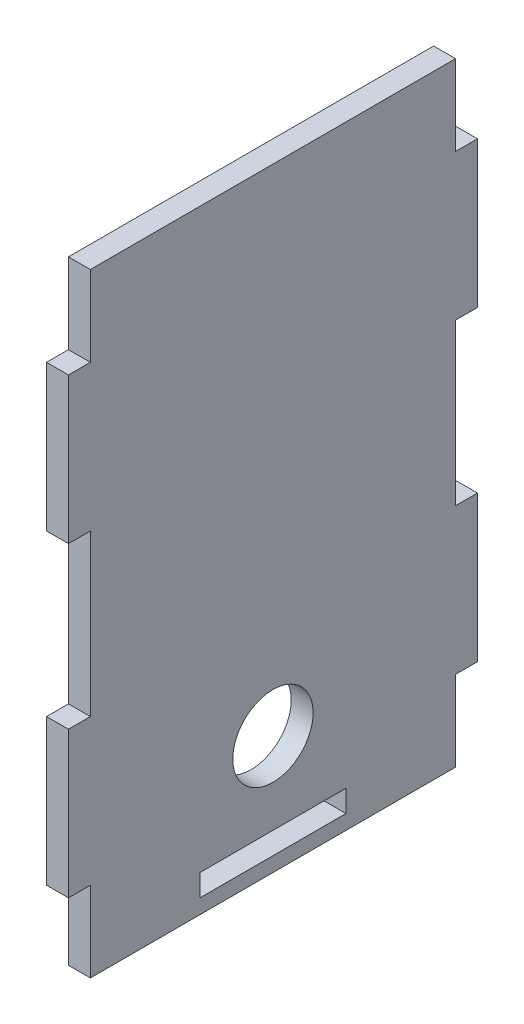
ISO-10303-21;
HEADER;
FILE_DESCRIPTION(('STEP AP214'),'2;1');
FILE_NAME('part.step','',(''),(''),'','','');
FILE_SCHEMA(('AUTOMOTIVE_DESIGN { 1 0 10303 214 1 1 1 1 }'));
ENDSEC;
DATA;
#1=APPLICATION_CONTEXT('core data for automotive mechanical design processes');
#2=APPLICATION_PROTOCOL_DEFINITION('international standard','automotive_design',2000,#1);
#3=PRODUCT_CONTEXT('',#1,'mechanical');
#4=PRODUCT('Part','Part','',(#3));
#5=PRODUCT_RELATED_PRODUCT_CATEGORY('part','',(#4));
#6=PRODUCT_DEFINITION_FORMATION('','',#4);
#7=PRODUCT_DEFINITION_CONTEXT('part definition',#1,'design');
#8=PRODUCT_DEFINITION('design','',#6,#7);
#9=PRODUCT_DEFINITION_SHAPE('','',#8);
#10=(LENGTH_UNIT() NAMED_UNIT(*) SI_UNIT(.MILLI.,.METRE.));
#11=(NAMED_UNIT(*) PLANE_ANGLE_UNIT() SI_UNIT($,.RADIAN.));
#12=(NAMED_UNIT(*) SI_UNIT($,.STERADIAN.) SOLID_ANGLE_UNIT());
#13=UNCERTAINTY_MEASURE_WITH_UNIT(LENGTH_MEASURE(1.E-05),#10,'distance_accuracy_value','');
#14=(GEOMETRIC_REPRESENTATION_CONTEXT(3) GLOBAL_UNCERTAINTY_ASSIGNED_CONTEXT((#13)) GLOBAL_UNIT_ASSIGNED_CONTEXT((#10,
#11,#12)) REPRESENTATION_CONTEXT('',''));
#15=CARTESIAN_POINT('',(0.,0.,0.));
#16=DIRECTION('',(0.,0.,1.));
#17=DIRECTION('',(1.,0.,0.));
#18=AXIS2_PLACEMENT_3D('',#15,#16,#17);
#19=CARTESIAN_POINT('',(3.,0.,0.));
#20=DIRECTION('',(1.,0.,0.));
#21=DIRECTION('',(0.,0.,-1.));
#22=AXIS2_PLACEMENT_3D('',#19,#20,#21);
#23=PLANE('',#22);
#24=DIRECTION('',(0.,0.,1.));
#25=VECTOR('',#24,1.);
#26=CARTESIAN_POINT('',(3.,5.,-15.));
#27=LINE('',#26,#25);
#28=CARTESIAN_POINT('',(3.,5.,-35.));
#29=VERTEX_POINT('',#28);
#30=CARTESIAN_POINT('',(3.,5.,-15.));
#31=VERTEX_POINT('',#30);
#32=EDGE_CURVE('E208',#29,#31,#27,.T.);
#33=ORIENTED_EDGE('',*,*,#32,.F.);
#34=DIRECTION('',(0.,1.,0.));
#35=VECTOR('',#34,1.);
#36=CARTESIAN_POINT('',(3.,2.,-35.));
#37=LINE('',#36,#35);
#38=CARTESIAN_POINT('',(3.,2.,-35.));
#39=VERTEX_POINT('',#38);
#40=EDGE_CURVE('E200',#39,#29,#37,.T.);
#41=ORIENTED_EDGE('',*,*,#40,.F.);
#42=DIRECTION('',(0.,0.,-1.));
#43=VECTOR('',#42,1.);
#44=CARTESIAN_POINT('',(3.,2.,-15.));
#45=LINE('',#44,#43);
#46=CARTESIAN_POINT('',(3.,2.,-15.));
#47=VERTEX_POINT('',#46);
#48=EDGE_CURVE('E223',#47,#39,#45,.T.);
#49=ORIENTED_EDGE('',*,*,#48,.F.);
#50=DIRECTION('',(0.,-1.,0.));
#51=VECTOR('',#50,1.);
#52=CARTESIAN_POINT('',(3.,2.,-15.));
#53=LINE('',#52,#51);
#54=EDGE_CURVE('E221',#31,#47,#53,.T.);
#55=ORIENTED_EDGE('',*,*,#54,.F.);
#56=EDGE_LOOP('',(#33,#41,#49,#55));
#57=FACE_BOUND('',#56,.T.);
#58=DIRECTION('',(0.,-1.,0.));
#59=VECTOR('',#58,1.);
#60=CARTESIAN_POINT('',(3.,0.,0.));
#61=LINE('',#60,#59);
#62=CARTESIAN_POINT('',(3.,11.,0.));
#63=VERTEX_POINT('',#62);
#64=CARTESIAN_POINT('',(3.,0.,0.));
#65=VERTEX_POINT('',#64);
#66=EDGE_CURVE('E239',#63,#65,#61,.T.);
#67=ORIENTED_EDGE('',*,*,#66,.T.);
#68=DIRECTION('',(0.,0.,-1.));
#69=VECTOR('',#68,1.);
#70=CARTESIAN_POINT('',(3.,0.,0.));
#71=LINE('',#70,#69);
#72=CARTESIAN_POINT('',(3.,0.,-50.));
#73=VERTEX_POINT('',#72);
#74=EDGE_CURVE('E242',#65,#73,#71,.T.);
#75=ORIENTED_EDGE('',*,*,#74,.T.);
#76=DIRECTION('',(0.,1.,0.));
#77=VECTOR('',#76,1.);
#78=CARTESIAN_POINT('',(3.,0.,-50.));
#79=LINE('',#78,#77);
#80=CARTESIAN_POINT('',(3.,11.,-50.));
#81=VERTEX_POINT('',#80);
#82=EDGE_CURVE('E245',#73,#81,#79,.T.);
#83=ORIENTED_EDGE('',*,*,#82,.T.);
#84=DIRECTION('',(0.,0.,-1.));
#85=VECTOR('',#84,1.);
#86=CARTESIAN_POINT('',(3.,11.,-50.));
#87=LINE('',#86,#85);
#88=CARTESIAN_POINT('',(3.,11.,-53.));
#89=VERTEX_POINT('',#88);
#90=EDGE_CURVE('E247',#81,#89,#87,.T.);
#91=ORIENTED_EDGE('',*,*,#90,.T.);
#92=DIRECTION('',(0.,1.,0.));
#93=VECTOR('',#92,1.);
#94=CARTESIAN_POINT('',(3.,31.,-53.));
#95=LINE('',#94,#93);
#96=CARTESIAN_POINT('',(3.,31.,-53.));
#97=VERTEX_POINT('',#96);
#98=EDGE_CURVE('E249',#89,#97,#95,.T.);
#99=ORIENTED_EDGE('',*,*,#98,.T.);
#100=DIRECTION('',(0.,0.,1.));
#101=VECTOR('',#100,1.);
#102=CARTESIAN_POINT('',(3.,31.,-50.));
#103=LINE('',#102,#101);
#104=CARTESIAN_POINT('',(3.,31.,-50.));
#105=VERTEX_POINT('',#104);
#106=EDGE_CURVE('E251',#97,#105,#103,.T.);
#107=ORIENTED_EDGE('',*,*,#106,.T.);
#108=DIRECTION('',(0.,1.,0.));
#109=VECTOR('',#108,1.);
#110=CARTESIAN_POINT('',(3.,31.,-50.));
#111=LINE('',#110,#109);
#112=CARTESIAN_POINT('',(3.,53.,-50.));
#113=VERTEX_POINT('',#112);
#114=EDGE_CURVE('E253',#105,#113,#111,.T.);
#115=ORIENTED_EDGE('',*,*,#114,.T.);
#116=DIRECTION('',(0.,0.,-1.));
#117=VECTOR('',#116,1.);
#118=CARTESIAN_POINT('',(3.,53.,-50.));
#119=LINE('',#118,#117);
#120=CARTESIAN_POINT('',(3.,53.,-53.));
#121=VERTEX_POINT('',#120);
#122=EDGE_CURVE('E255',#113,#121,#119,.T.);
#123=ORIENTED_EDGE('',*,*,#122,.T.);
#124=DIRECTION('',(0.,1.,0.));
#125=VECTOR('',#124,1.);
#126=CARTESIAN_POINT('',(3.,53.,-53.));
#127=LINE('',#126,#125);
#128=CARTESIAN_POINT('',(3.,73.,-53.));
#129=VERTEX_POINT('',#128);
#130=EDGE_CURVE('E257',#121,#129,#127,.T.);
#131=ORIENTED_EDGE('',*,*,#130,.T.);
#132=DIRECTION('',(0.,0.,1.));
#133=VECTOR('',#132,1.);
#134=CARTESIAN_POINT('',(3.,73.,-50.));
#135=LINE('',#134,#133);
#136=CARTESIAN_POINT('',(3.,73.,-50.));
#137=VERTEX_POINT('',#136);
#138=EDGE_CURVE('E259',#129,#137,#135,.T.);
#139=ORIENTED_EDGE('',*,*,#138,.T.);
#140=DIRECTION('',(0.,1.,0.));
#141=VECTOR('',#140,1.);
#142=CARTESIAN_POINT('',(3.,73.,-50.));
#143=LINE('',#142,#141);
#144=CARTESIAN_POINT('',(3.,84.,-50.));
#145=VERTEX_POINT('',#144);
#146=EDGE_CURVE('E261',#137,#145,#143,.T.);
#147=ORIENTED_EDGE('',*,*,#146,.T.);
#148=DIRECTION('',(0.,0.,1.));
#149=VECTOR('',#148,1.);
#150=CARTESIAN_POINT('',(3.,84.,0.));
#151=LINE('',#150,#149);
#152=CARTESIAN_POINT('',(3.,84.,0.));
#153=VERTEX_POINT('',#152);
#154=EDGE_CURVE('E263',#145,#153,#151,.T.);
#155=ORIENTED_EDGE('',*,*,#154,.T.);
#156=DIRECTION('',(0.,-1.,0.));
#157=VECTOR('',#156,1.);
#158=CARTESIAN_POINT('',(3.,73.,0.));
#159=LINE('',#158,#157);
#160=CARTESIAN_POINT('',(3.,73.,0.));
#161=VERTEX_POINT('',#160);
#162=EDGE_CURVE('E265',#153,#161,#159,.T.);
#163=ORIENTED_EDGE('',*,*,#162,.T.);
#164=DIRECTION('',(0.,0.,1.));
#165=VECTOR('',#164,1.);
#166=CARTESIAN_POINT('',(3.,73.,0.));
#167=LINE('',#166,#165);
#168=CARTESIAN_POINT('',(3.,73.,3.));
#169=VERTEX_POINT('',#168);
#170=EDGE_CURVE('E267',#161,#169,#167,.T.);
#171=ORIENTED_EDGE('',*,*,#170,.T.);
#172=DIRECTION('',(0.,-1.,0.));
#173=VECTOR('',#172,1.);
#174=CARTESIAN_POINT('',(3.,53.,3.));
#175=LINE('',#174,#173);
#176=CARTESIAN_POINT('',(3.,53.,3.));
#177=VERTEX_POINT('',#176);
#178=EDGE_CURVE('E269',#169,#177,#175,.T.);
#179=ORIENTED_EDGE('',*,*,#178,.T.);
#180=DIRECTION('',(0.,0.,-1.));
#181=VECTOR('',#180,1.);
#182=CARTESIAN_POINT('',(3.,53.,0.));
#183=LINE('',#182,#181);
#184=CARTESIAN_POINT('',(3.,53.,0.));
#185=VERTEX_POINT('',#184);
#186=EDGE_CURVE('E271',#177,#185,#183,.T.);
#187=ORIENTED_EDGE('',*,*,#186,.T.);
#188=DIRECTION('',(0.,-1.,0.));
#189=VECTOR('',#188,1.);
#190=CARTESIAN_POINT('',(3.,31.,0.));
#191=LINE('',#190,#189);
#192=CARTESIAN_POINT('',(3.,31.,0.));
#193=VERTEX_POINT('',#192);
#194=EDGE_CURVE('E273',#185,#193,#191,.T.);
#195=ORIENTED_EDGE('',*,*,#194,.T.);
#196=DIRECTION('',(0.,0.,1.));
#197=VECTOR('',#196,1.);
#198=CARTESIAN_POINT('',(3.,31.,0.));
#199=LINE('',#198,#197);
#200=CARTESIAN_POINT('',(3.,31.,3.));
#201=VERTEX_POINT('',#200);
#202=EDGE_CURVE('E275',#193,#201,#199,.T.);
#203=ORIENTED_EDGE('',*,*,#202,.T.);
#204=DIRECTION('',(0.,-1.,0.));
#205=VECTOR('',#204,1.);
#206=CARTESIAN_POINT('',(3.,31.,3.));
#207=LINE('',#206,#205);
#208=CARTESIAN_POINT('',(3.,11.,3.));
#209=VERTEX_POINT('',#208);
#210=EDGE_CURVE('E277',#201,#209,#207,.T.);
#211=ORIENTED_EDGE('',*,*,#210,.T.);
#212=DIRECTION('',(0.,0.,-1.));
#213=VECTOR('',#212,1.);
#214=CARTESIAN_POINT('',(3.,11.,0.));
#215=LINE('',#214,#213);
#216=EDGE_CURVE('E279',#209,#63,#215,.T.);
#217=ORIENTED_EDGE('',*,*,#216,.T.);
#218=EDGE_LOOP('',(#67,#75,#83,#91,#99,#107,#115,#123,#131,#139,#147,#155,#163,#171,#179,#187,
#195,#203,#211,#217));
#219=FACE_BOUND('',#218,.T.);
#220=CARTESIAN_POINT('',(3.,16.2,-25.));
#221=DIRECTION('',(1.,0.,0.));
#222=DIRECTION('',(0.,0.,-1.));
#223=AXIS2_PLACEMENT_3D('',#220,#221,#222);
#224=CIRCLE('',#223,5.5);
#225=CARTESIAN_POINT('',(3.,16.2,-30.5));
#226=VERTEX_POINT('',#225);
#227=EDGE_CURVE('E229',#226,#226,#224,.T.);
#228=ORIENTED_EDGE('',*,*,#227,.F.);
#229=EDGE_LOOP('',(#228));
#230=FACE_BOUND('',#229,.T.);
#231=ADVANCED_FACE('F39',(#57,#219,#230),#23,.T.);
#232=CARTESIAN_POINT('',(0.,0.,0.));
#233=DIRECTION('',(1.,0.,0.));
#234=DIRECTION('',(0.,0.,-1.));
#235=AXIS2_PLACEMENT_3D('',#232,#233,#234);
#236=PLANE('',#235);
#237=DIRECTION('',(0.,-1.,0.));
#238=VECTOR('',#237,1.);
#239=CARTESIAN_POINT('',(0.,0.,0.));
#240=LINE('',#239,#238);
#241=CARTESIAN_POINT('',(0.,11.,0.));
#242=VERTEX_POINT('',#241);
#243=CARTESIAN_POINT('',(0.,0.,0.));
#244=VERTEX_POINT('',#243);
#245=EDGE_CURVE('E216',#242,#244,#240,.T.);
#246=ORIENTED_EDGE('',*,*,#245,.F.);
#247=DIRECTION('',(0.,0.,-1.));
#248=VECTOR('',#247,1.);
#249=CARTESIAN_POINT('',(0.,11.,0.));
#250=LINE('',#249,#248);
#251=CARTESIAN_POINT('',(0.,11.,3.));
#252=VERTEX_POINT('',#251);
#253=EDGE_CURVE('E243',#252,#242,#250,.T.);
#254=ORIENTED_EDGE('',*,*,#253,.F.);
#255=DIRECTION('',(0.,-1.,0.));
#256=VECTOR('',#255,1.);
#257=CARTESIAN_POINT('',(0.,31.,3.));
#258=LINE('',#257,#256);
#259=CARTESIAN_POINT('',(0.,31.,3.));
#260=VERTEX_POINT('',#259);
#261=EDGE_CURVE('E318',#260,#252,#258,.T.);
#262=ORIENTED_EDGE('',*,*,#261,.F.);
#263=DIRECTION('',(0.,0.,1.));
#264=VECTOR('',#263,1.);
#265=CARTESIAN_POINT('',(0.,31.,0.));
#266=LINE('',#265,#264);
#267=CARTESIAN_POINT('',(0.,31.,0.));
#268=VERTEX_POINT('',#267);
#269=EDGE_CURVE('E316',#268,#260,#266,.T.);
#270=ORIENTED_EDGE('',*,*,#269,.F.);
#271=DIRECTION('',(0.,-1.,0.));
#272=VECTOR('',#271,1.);
#273=CARTESIAN_POINT('',(0.,31.,0.));
#274=LINE('',#273,#272);
#275=CARTESIAN_POINT('',(0.,53.,0.));
#276=VERTEX_POINT('',#275);
#277=EDGE_CURVE('E314',#276,#268,#274,.T.);
#278=ORIENTED_EDGE('',*,*,#277,.F.);
#279=DIRECTION('',(0.,0.,-1.));
#280=VECTOR('',#279,1.);
#281=CARTESIAN_POINT('',(0.,53.,0.));
#282=LINE('',#281,#280);
#283=CARTESIAN_POINT('',(0.,53.,3.));
#284=VERTEX_POINT('',#283);
#285=EDGE_CURVE('E312',#284,#276,#282,.T.);
#286=ORIENTED_EDGE('',*,*,#285,.F.);
#287=DIRECTION('',(0.,-1.,0.));
#288=VECTOR('',#287,1.);
#289=CARTESIAN_POINT('',(0.,53.,3.));
#290=LINE('',#289,#288);
#291=CARTESIAN_POINT('',(0.,73.,3.));
#292=VERTEX_POINT('',#291);
#293=EDGE_CURVE('E310',#292,#284,#290,.T.);
#294=ORIENTED_EDGE('',*,*,#293,.F.);
#295=DIRECTION('',(0.,0.,1.));
#296=VECTOR('',#295,1.);
#297=CARTESIAN_POINT('',(0.,73.,0.));
#298=LINE('',#297,#296);
#299=CARTESIAN_POINT('',(0.,73.,0.));
#300=VERTEX_POINT('',#299);
#301=EDGE_CURVE('E308',#300,#292,#298,.T.);
#302=ORIENTED_EDGE('',*,*,#301,.F.);
#303=DIRECTION('',(0.,-1.,0.));
#304=VECTOR('',#303,1.);
#305=CARTESIAN_POINT('',(0.,73.,0.));
#306=LINE('',#305,#304);
#307=CARTESIAN_POINT('',(0.,84.,0.));
#308=VERTEX_POINT('',#307);
#309=EDGE_CURVE('E306',#308,#300,#306,.T.);
#310=ORIENTED_EDGE('',*,*,#309,.F.);
#311=DIRECTION('',(0.,0.,1.));
#312=VECTOR('',#311,1.);
#313=CARTESIAN_POINT('',(0.,84.,0.));
#314=LINE('',#313,#312);
#315=CARTESIAN_POINT('',(0.,84.,-50.));
#316=VERTEX_POINT('',#315);
#317=EDGE_CURVE('E304',#316,#308,#314,.T.);
#318=ORIENTED_EDGE('',*,*,#317,.F.);
#319=DIRECTION('',(0.,1.,0.));
#320=VECTOR('',#319,1.);
#321=CARTESIAN_POINT('',(0.,73.,-50.));
#322=LINE('',#321,#320);
#323=CARTESIAN_POINT('',(0.,73.,-50.));
#324=VERTEX_POINT('',#323);
#325=EDGE_CURVE('E302',#324,#316,#322,.T.);
#326=ORIENTED_EDGE('',*,*,#325,.F.);
#327=DIRECTION('',(0.,0.,1.));
#328=VECTOR('',#327,1.);
#329=CARTESIAN_POINT('',(0.,73.,-50.));
#330=LINE('',#329,#328);
#331=CARTESIAN_POINT('',(0.,73.,-53.));
#332=VERTEX_POINT('',#331);
#333=EDGE_CURVE('E300',#332,#324,#330,.T.);
#334=ORIENTED_EDGE('',*,*,#333,.F.);
#335=DIRECTION('',(0.,1.,0.));
#336=VECTOR('',#335,1.);
#337=CARTESIAN_POINT('',(0.,53.,-53.));
#338=LINE('',#337,#336);
#339=CARTESIAN_POINT('',(0.,53.,-53.));
#340=VERTEX_POINT('',#339);
#341=EDGE_CURVE('E298',#340,#332,#338,.T.);
#342=ORIENTED_EDGE('',*,*,#341,.F.);
#343=DIRECTION('',(0.,0.,-1.));
#344=VECTOR('',#343,1.);
#345=CARTESIAN_POINT('',(0.,53.,-50.));
#346=LINE('',#345,#344);
#347=CARTESIAN_POINT('',(0.,53.,-50.));
#348=VERTEX_POINT('',#347);
#349=EDGE_CURVE('E296',#348,#340,#346,.T.);
#350=ORIENTED_EDGE('',*,*,#349,.F.);
#351=DIRECTION('',(0.,1.,0.));
#352=VECTOR('',#351,1.);
#353=CARTESIAN_POINT('',(0.,31.,-50.));
#354=LINE('',#353,#352);
#355=CARTESIAN_POINT('',(0.,31.,-50.));
#356=VERTEX_POINT('',#355);
#357=EDGE_CURVE('E294',#356,#348,#354,.T.);
#358=ORIENTED_EDGE('',*,*,#357,.F.);
#359=DIRECTION('',(0.,0.,1.));
#360=VECTOR('',#359,1.);
#361=CARTESIAN_POINT('',(0.,31.,-50.));
#362=LINE('',#361,#360);
#363=CARTESIAN_POINT('',(0.,31.,-53.));
#364=VERTEX_POINT('',#363);
#365=EDGE_CURVE('E292',#364,#356,#362,.T.);
#366=ORIENTED_EDGE('',*,*,#365,.F.);
#367=DIRECTION('',(0.,1.,0.));
#368=VECTOR('',#367,1.);
#369=CARTESIAN_POINT('',(0.,31.,-53.));
#370=LINE('',#369,#368);
#371=CARTESIAN_POINT('',(0.,11.,-53.));
#372=VERTEX_POINT('',#371);
#373=EDGE_CURVE('E290',#372,#364,#370,.T.);
#374=ORIENTED_EDGE('',*,*,#373,.F.);
#375=DIRECTION('',(0.,0.,-1.));
#376=VECTOR('',#375,1.);
#377=CARTESIAN_POINT('',(0.,11.,-50.));
#378=LINE('',#377,#376);
#379=CARTESIAN_POINT('',(0.,11.,-50.));
#380=VERTEX_POINT('',#379);
#381=EDGE_CURVE('E288',#380,#372,#378,.T.);
#382=ORIENTED_EDGE('',*,*,#381,.F.);
#383=DIRECTION('',(0.,1.,0.));
#384=VECTOR('',#383,1.);
#385=CARTESIAN_POINT('',(0.,0.,-50.));
#386=LINE('',#385,#384);
#387=CARTESIAN_POINT('',(0.,0.,-50.));
#388=VERTEX_POINT('',#387);
#389=EDGE_CURVE('E286',#388,#380,#386,.T.);
#390=ORIENTED_EDGE('',*,*,#389,.F.);
#391=DIRECTION('',(0.,0.,-1.));
#392=VECTOR('',#391,1.);
#393=CARTESIAN_POINT('',(0.,0.,0.));
#394=LINE('',#393,#392);
#395=EDGE_CURVE('E284',#244,#388,#394,.T.);
#396=ORIENTED_EDGE('',*,*,#395,.F.);
#397=EDGE_LOOP('',(#246,#254,#262,#270,#278,#286,#294,#302,#310,#318,#326,#334,#342,#350,#358,
#366,#374,#382,#390,#396));
#398=FACE_BOUND('',#397,.T.);
#399=DIRECTION('',(0.,1.,0.));
#400=VECTOR('',#399,1.);
#401=CARTESIAN_POINT('',(0.,2.,-35.));
#402=LINE('',#401,#400);
#403=CARTESIAN_POINT('',(0.,2.,-35.));
#404=VERTEX_POINT('',#403);
#405=CARTESIAN_POINT('',(0.,5.,-35.));
#406=VERTEX_POINT('',#405);
#407=EDGE_CURVE('E62',#404,#406,#402,.T.);
#408=ORIENTED_EDGE('',*,*,#407,.T.);
#409=DIRECTION('',(0.,0.,1.));
#410=VECTOR('',#409,1.);
#411=CARTESIAN_POINT('',(0.,5.,-15.));
#412=LINE('',#411,#410);
#413=CARTESIAN_POINT('',(0.,5.,-15.));
#414=VERTEX_POINT('',#413);
#415=EDGE_CURVE('E215',#406,#414,#412,.T.);
#416=ORIENTED_EDGE('',*,*,#415,.T.);
#417=DIRECTION('',(0.,-1.,0.));
#418=VECTOR('',#417,1.);
#419=CARTESIAN_POINT('',(0.,2.,-15.));
#420=LINE('',#419,#418);
#421=CARTESIAN_POINT('',(0.,2.,-15.));
#422=VERTEX_POINT('',#421);
#423=EDGE_CURVE('E231',#414,#422,#420,.T.);
#424=ORIENTED_EDGE('',*,*,#423,.T.);
#425=DIRECTION('',(0.,0.,-1.));
#426=VECTOR('',#425,1.);
#427=CARTESIAN_POINT('',(0.,2.,-15.));
#428=LINE('',#427,#426);
#429=EDGE_CURVE('E209',#422,#404,#428,.T.);
#430=ORIENTED_EDGE('',*,*,#429,.T.);
#431=EDGE_LOOP('',(#408,#416,#424,#430));
#432=FACE_BOUND('',#431,.T.);
#433=CARTESIAN_POINT('',(0.,16.2,-25.));
#434=DIRECTION('',(1.,0.,0.));
#435=DIRECTION('',(0.,0.,-1.));
#436=AXIS2_PLACEMENT_3D('',#433,#434,#435);
#437=CIRCLE('',#436,5.5);
#438=CARTESIAN_POINT('',(0.,16.2,-30.5));
#439=VERTEX_POINT('',#438);
#440=EDGE_CURVE('E699',#439,#439,#437,.T.);
#441=ORIENTED_EDGE('',*,*,#440,.T.);
#442=EDGE_LOOP('',(#441));
#443=FACE_BOUND('',#442,.T.);
#444=ADVANCED_FACE('F384',(#398,#432,#443),#236,.F.);
#445=CARTESIAN_POINT('',(3.,0.,0.));
#446=DIRECTION('',(0.,0.,-1.));
#447=DIRECTION('',(-1.,0.,0.));
#448=AXIS2_PLACEMENT_3D('',#445,#446,#447);
#449=PLANE('',#448);
#450=ORIENTED_EDGE('',*,*,#245,.T.);
#451=DIRECTION('',(-1.,0.,0.));
#452=VECTOR('',#451,1.);
#453=CARTESIAN_POINT('',(3.,0.,0.));
#454=LINE('',#453,#452);
#455=EDGE_CURVE('E11',#65,#244,#454,.T.);
#456=ORIENTED_EDGE('',*,*,#455,.F.);
#457=ORIENTED_EDGE('',*,*,#66,.F.);
#458=DIRECTION('',(-1.,0.,0.));
#459=VECTOR('',#458,1.);
#460=CARTESIAN_POINT('',(3.,11.,0.));
#461=LINE('',#460,#459);
#462=EDGE_CURVE('E281',#63,#242,#461,.T.);
#463=ORIENTED_EDGE('',*,*,#462,.T.);
#464=EDGE_LOOP('',(#450,#456,#457,#463));
#465=FACE_BOUND('',#464,.T.);
#466=ADVANCED_FACE('F41',(#465),#449,.F.);
#467=CARTESIAN_POINT('',(3.,0.,0.));
#468=DIRECTION('',(0.,1.,0.));
#469=DIRECTION('',(0.,0.,1.));
#470=AXIS2_PLACEMENT_3D('',#467,#468,#469);
#471=PLANE('',#470);
#472=ORIENTED_EDGE('',*,*,#395,.T.);
#473=DIRECTION('',(-1.,0.,0.));
#474=VECTOR('',#473,1.);
#475=CARTESIAN_POINT('',(3.,0.,-50.));
#476=LINE('',#475,#474);
#477=EDGE_CURVE('E47',#73,#388,#476,.T.);
#478=ORIENTED_EDGE('',*,*,#477,.F.);
#479=ORIENTED_EDGE('',*,*,#74,.F.);
#480=ORIENTED_EDGE('',*,*,#455,.T.);
#481=EDGE_LOOP('',(#472,#478,#479,#480));
#482=FACE_BOUND('',#481,.T.);
#483=ADVANCED_FACE('F401',(#482),#471,.F.);
#484=CARTESIAN_POINT('',(3.,0.,-50.));
#485=DIRECTION('',(0.,0.,1.));
#486=DIRECTION('',(1.,0.,0.));
#487=AXIS2_PLACEMENT_3D('',#484,#485,#486);
#488=PLANE('',#487);
#489=ORIENTED_EDGE('',*,*,#389,.T.);
#490=DIRECTION('',(-1.,0.,0.));
#491=VECTOR('',#490,1.);
#492=CARTESIAN_POINT('',(3.,11.,-50.));
#493=LINE('',#492,#491);
#494=EDGE_CURVE('E371',#81,#380,#493,.T.);
#495=ORIENTED_EDGE('',*,*,#494,.F.);
#496=ORIENTED_EDGE('',*,*,#82,.F.);
#497=ORIENTED_EDGE('',*,*,#477,.T.);
#498=EDGE_LOOP('',(#489,#495,#496,#497));
#499=FACE_BOUND('',#498,.T.);
#500=ADVANCED_FACE('F378',(#499),#488,.F.);
#501=CARTESIAN_POINT('',(3.,11.,-50.));
#502=DIRECTION('',(0.,1.,0.));
#503=DIRECTION('',(0.,0.,1.));
#504=AXIS2_PLACEMENT_3D('',#501,#502,#503);
#505=PLANE('',#504);
#506=ORIENTED_EDGE('',*,*,#381,.T.);
#507=DIRECTION('',(-1.,0.,0.));
#508=VECTOR('',#507,1.);
#509=CARTESIAN_POINT('',(3.,11.,-53.));
#510=LINE('',#509,#508);
#511=EDGE_CURVE('E368',#89,#372,#510,.T.);
#512=ORIENTED_EDGE('',*,*,#511,.F.);
#513=ORIENTED_EDGE('',*,*,#90,.F.);
#514=ORIENTED_EDGE('',*,*,#494,.T.);
#515=EDGE_LOOP('',(#506,#512,#513,#514));
#516=FACE_BOUND('',#515,.T.);
#517=ADVANCED_FACE('F390',(#516),#505,.F.);
#518=CARTESIAN_POINT('',(3.,31.,-53.));
#519=DIRECTION('',(0.,0.,1.));
#520=DIRECTION('',(1.,0.,0.));
#521=AXIS2_PLACEMENT_3D('',#518,#519,#520);
#522=PLANE('',#521);
#523=ORIENTED_EDGE('',*,*,#373,.T.);
#524=DIRECTION('',(-1.,0.,0.));
#525=VECTOR('',#524,1.);
#526=CARTESIAN_POINT('',(3.,31.,-53.));
#527=LINE('',#526,#525);
#528=EDGE_CURVE('E365',#97,#364,#527,.T.);
#529=ORIENTED_EDGE('',*,*,#528,.F.);
#530=ORIENTED_EDGE('',*,*,#98,.F.);
#531=ORIENTED_EDGE('',*,*,#511,.T.);
#532=EDGE_LOOP('',(#523,#529,#530,#531));
#533=FACE_BOUND('',#532,.T.);
#534=ADVANCED_FACE('F394',(#533),#522,.F.);
#535=CARTESIAN_POINT('',(3.,31.,-50.));
#536=DIRECTION('',(0.,-1.,0.));
#537=DIRECTION('',(0.,0.,-1.));
#538=AXIS2_PLACEMENT_3D('',#535,#536,#537);
#539=PLANE('',#538);
#540=ORIENTED_EDGE('',*,*,#365,.T.);
#541=DIRECTION('',(-1.,0.,0.));
#542=VECTOR('',#541,1.);
#543=CARTESIAN_POINT('',(3.,31.,-50.));
#544=LINE('',#543,#542);
#545=EDGE_CURVE('E362',#105,#356,#544,.T.);
#546=ORIENTED_EDGE('',*,*,#545,.F.);
#547=ORIENTED_EDGE('',*,*,#106,.F.);
#548=ORIENTED_EDGE('',*,*,#528,.T.);
#549=EDGE_LOOP('',(#540,#546,#547,#548));
#550=FACE_BOUND('',#549,.T.);
#551=ADVANCED_FACE('F474',(#550),#539,.F.);
#552=CARTESIAN_POINT('',(3.,31.,-50.));
#553=DIRECTION('',(0.,0.,1.));
#554=DIRECTION('',(0.,-1.,0.));
#555=AXIS2_PLACEMENT_3D('',#552,#553,#554);
#556=PLANE('',#555);
#557=ORIENTED_EDGE('',*,*,#357,.T.);
#558=DIRECTION('',(-1.,0.,0.));
#559=VECTOR('',#558,1.);
#560=CARTESIAN_POINT('',(3.,53.,-50.));
#561=LINE('',#560,#559);
#562=EDGE_CURVE('E359',#113,#348,#561,.T.);
#563=ORIENTED_EDGE('',*,*,#562,.F.);
#564=ORIENTED_EDGE('',*,*,#114,.F.);
#565=ORIENTED_EDGE('',*,*,#545,.T.);
#566=EDGE_LOOP('',(#557,#563,#564,#565));
#567=FACE_BOUND('',#566,.T.);
#568=ADVANCED_FACE('F472',(#567),#556,.F.);
#569=CARTESIAN_POINT('',(3.,53.,-50.));
#570=DIRECTION('',(0.,1.,0.));
#571=DIRECTION('',(0.,0.,1.));
#572=AXIS2_PLACEMENT_3D('',#569,#570,#571);
#573=PLANE('',#572);
#574=ORIENTED_EDGE('',*,*,#349,.T.);
#575=DIRECTION('',(-1.,0.,0.));
#576=VECTOR('',#575,1.);
#577=CARTESIAN_POINT('',(3.,53.,-53.));
#578=LINE('',#577,#576);
#579=EDGE_CURVE('E356',#121,#340,#578,.T.);
#580=ORIENTED_EDGE('',*,*,#579,.F.);
#581=ORIENTED_EDGE('',*,*,#122,.F.);
#582=ORIENTED_EDGE('',*,*,#562,.T.);
#583=EDGE_LOOP('',(#574,#580,#581,#582));
#584=FACE_BOUND('',#583,.T.);
#585=ADVANCED_FACE('F467',(#584),#573,.F.);
#586=CARTESIAN_POINT('',(3.,53.,-53.));
#587=DIRECTION('',(0.,0.,1.));
#588=DIRECTION('',(1.,0.,0.));
#589=AXIS2_PLACEMENT_3D('',#586,#587,#588);
#590=PLANE('',#589);
#591=ORIENTED_EDGE('',*,*,#341,.T.);
#592=DIRECTION('',(-1.,0.,0.));
#593=VECTOR('',#592,1.);
#594=CARTESIAN_POINT('',(3.,73.,-53.));
#595=LINE('',#594,#593);
#596=EDGE_CURVE('E353',#129,#332,#595,.T.);
#597=ORIENTED_EDGE('',*,*,#596,.F.);
#598=ORIENTED_EDGE('',*,*,#130,.F.);
#599=ORIENTED_EDGE('',*,*,#579,.T.);
#600=EDGE_LOOP('',(#591,#597,#598,#599));
#601=FACE_BOUND('',#600,.T.);
#602=ADVANCED_FACE('F462',(#601),#590,.F.);
#603=CARTESIAN_POINT('',(3.,73.,-50.));
#604=DIRECTION('',(0.,-1.,0.));
#605=DIRECTION('',(0.,0.,-1.));
#606=AXIS2_PLACEMENT_3D('',#603,#604,#605);
#607=PLANE('',#606);
#608=ORIENTED_EDGE('',*,*,#333,.T.);
#609=DIRECTION('',(-1.,0.,0.));
#610=VECTOR('',#609,1.);
#611=CARTESIAN_POINT('',(3.,73.,-50.));
#612=LINE('',#611,#610);
#613=EDGE_CURVE('E350',#137,#324,#612,.T.);
#614=ORIENTED_EDGE('',*,*,#613,.F.);
#615=ORIENTED_EDGE('',*,*,#138,.F.);
#616=ORIENTED_EDGE('',*,*,#596,.T.);
#617=EDGE_LOOP('',(#608,#614,#615,#616));
#618=FACE_BOUND('',#617,.T.);
#619=ADVANCED_FACE('F458',(#618),#607,.F.);
#620=CARTESIAN_POINT('',(3.,73.,-50.));
#621=DIRECTION('',(0.,0.,1.));
#622=DIRECTION('',(1.,0.,0.));
#623=AXIS2_PLACEMENT_3D('',#620,#621,#622);
#624=PLANE('',#623);
#625=ORIENTED_EDGE('',*,*,#325,.T.);
#626=DIRECTION('',(-1.,0.,0.));
#627=VECTOR('',#626,1.);
#628=CARTESIAN_POINT('',(3.,84.,-50.));
#629=LINE('',#628,#627);
#630=EDGE_CURVE('E347',#145,#316,#629,.T.);
#631=ORIENTED_EDGE('',*,*,#630,.F.);
#632=ORIENTED_EDGE('',*,*,#146,.F.);
#633=ORIENTED_EDGE('',*,*,#613,.T.);
#634=EDGE_LOOP('',(#625,#631,#632,#633));
#635=FACE_BOUND('',#634,.T.);
#636=ADVANCED_FACE('F453',(#635),#624,.F.);
#637=CARTESIAN_POINT('',(3.,84.,0.));
#638=DIRECTION('',(0.,-1.,0.));
#639=DIRECTION('',(0.,0.,-1.));
#640=AXIS2_PLACEMENT_3D('',#637,#638,#639);
#641=PLANE('',#640);
#642=ORIENTED_EDGE('',*,*,#317,.T.);
#643=DIRECTION('',(-1.,0.,0.));
#644=VECTOR('',#643,1.);
#645=CARTESIAN_POINT('',(3.,84.,0.));
#646=LINE('',#645,#644);
#647=EDGE_CURVE('E344',#153,#308,#646,.T.);
#648=ORIENTED_EDGE('',*,*,#647,.F.);
#649=ORIENTED_EDGE('',*,*,#154,.F.);
#650=ORIENTED_EDGE('',*,*,#630,.T.);
#651=EDGE_LOOP('',(#642,#648,#649,#650));
#652=FACE_BOUND('',#651,.T.);
#653=ADVANCED_FACE('F447',(#652),#641,.F.);
#654=CARTESIAN_POINT('',(3.,73.,0.));
#655=DIRECTION('',(0.,0.,-1.));
#656=DIRECTION('',(-1.,0.,0.));
#657=AXIS2_PLACEMENT_3D('',#654,#655,#656);
#658=PLANE('',#657);
#659=ORIENTED_EDGE('',*,*,#309,.T.);
#660=DIRECTION('',(-1.,0.,0.));
#661=VECTOR('',#660,1.);
#662=CARTESIAN_POINT('',(3.,73.,0.));
#663=LINE('',#662,#661);
#664=EDGE_CURVE('E341',#161,#300,#663,.T.);
#665=ORIENTED_EDGE('',*,*,#664,.F.);
#666=ORIENTED_EDGE('',*,*,#162,.F.);
#667=ORIENTED_EDGE('',*,*,#647,.T.);
#668=EDGE_LOOP('',(#659,#665,#666,#667));
#669=FACE_BOUND('',#668,.T.);
#670=ADVANCED_FACE('F443',(#669),#658,.F.);
#671=CARTESIAN_POINT('',(3.,73.,0.));
#672=DIRECTION('',(0.,-1.,0.));
#673=DIRECTION('',(0.,0.,-1.));
#674=AXIS2_PLACEMENT_3D('',#671,#672,#673);
#675=PLANE('',#674);
#676=ORIENTED_EDGE('',*,*,#301,.T.);
#677=DIRECTION('',(-1.,0.,0.));
#678=VECTOR('',#677,1.);
#679=CARTESIAN_POINT('',(3.,73.,3.));
#680=LINE('',#679,#678);
#681=EDGE_CURVE('E338',#169,#292,#680,.T.);
#682=ORIENTED_EDGE('',*,*,#681,.F.);
#683=ORIENTED_EDGE('',*,*,#170,.F.);
#684=ORIENTED_EDGE('',*,*,#664,.T.);
#685=EDGE_LOOP('',(#676,#682,#683,#684));
#686=FACE_BOUND('',#685,.T.);
#687=ADVANCED_FACE('F438',(#686),#675,.F.);
#688=CARTESIAN_POINT('',(3.,53.,3.));
#689=DIRECTION('',(0.,0.,-1.));
#690=DIRECTION('',(-1.,0.,0.));
#691=AXIS2_PLACEMENT_3D('',#688,#689,#690);
#692=PLANE('',#691);
#693=ORIENTED_EDGE('',*,*,#293,.T.);
#694=DIRECTION('',(-1.,0.,0.));
#695=VECTOR('',#694,1.);
#696=CARTESIAN_POINT('',(3.,53.,3.));
#697=LINE('',#696,#695);
#698=EDGE_CURVE('E335',#177,#284,#697,.T.);
#699=ORIENTED_EDGE('',*,*,#698,.F.);
#700=ORIENTED_EDGE('',*,*,#178,.F.);
#701=ORIENTED_EDGE('',*,*,#681,.T.);
#702=EDGE_LOOP('',(#693,#699,#700,#701));
#703=FACE_BOUND('',#702,.T.);
#704=ADVANCED_FACE('F432',(#703),#692,.F.);
#705=CARTESIAN_POINT('',(3.,53.,0.));
#706=DIRECTION('',(0.,1.,0.));
#707=DIRECTION('',(0.,0.,1.));
#708=AXIS2_PLACEMENT_3D('',#705,#706,#707);
#709=PLANE('',#708);
#710=ORIENTED_EDGE('',*,*,#285,.T.);
#711=DIRECTION('',(-1.,0.,0.));
#712=VECTOR('',#711,1.);
#713=CARTESIAN_POINT('',(3.,53.,0.));
#714=LINE('',#713,#712);
#715=EDGE_CURVE('E332',#185,#276,#714,.T.);
#716=ORIENTED_EDGE('',*,*,#715,.F.);
#717=ORIENTED_EDGE('',*,*,#186,.F.);
#718=ORIENTED_EDGE('',*,*,#698,.T.);
#719=EDGE_LOOP('',(#710,#716,#717,#718));
#720=FACE_BOUND('',#719,.T.);
#721=ADVANCED_FACE('F428',(#720),#709,.F.);
#722=CARTESIAN_POINT('',(3.,31.,0.));
#723=DIRECTION('',(0.,0.,-1.));
#724=DIRECTION('',(-1.,0.,0.));
#725=AXIS2_PLACEMENT_3D('',#722,#723,#724);
#726=PLANE('',#725);
#727=ORIENTED_EDGE('',*,*,#277,.T.);
#728=DIRECTION('',(-1.,0.,0.));
#729=VECTOR('',#728,1.);
#730=CARTESIAN_POINT('',(3.,31.,0.));
#731=LINE('',#730,#729);
#732=EDGE_CURVE('E329',#193,#268,#731,.T.);
#733=ORIENTED_EDGE('',*,*,#732,.F.);
#734=ORIENTED_EDGE('',*,*,#194,.F.);
#735=ORIENTED_EDGE('',*,*,#715,.T.);
#736=EDGE_LOOP('',(#727,#733,#734,#735));
#737=FACE_BOUND('',#736,.T.);
#738=ADVANCED_FACE('F423',(#737),#726,.F.);
#739=CARTESIAN_POINT('',(3.,31.,0.));
#740=DIRECTION('',(0.,-1.,0.));
#741=DIRECTION('',(0.,0.,-1.));
#742=AXIS2_PLACEMENT_3D('',#739,#740,#741);
#743=PLANE('',#742);
#744=ORIENTED_EDGE('',*,*,#269,.T.);
#745=DIRECTION('',(-1.,0.,0.));
#746=VECTOR('',#745,1.);
#747=CARTESIAN_POINT('',(3.,31.,3.));
#748=LINE('',#747,#746);
#749=EDGE_CURVE('E326',#201,#260,#748,.T.);
#750=ORIENTED_EDGE('',*,*,#749,.F.);
#751=ORIENTED_EDGE('',*,*,#202,.F.);
#752=ORIENTED_EDGE('',*,*,#732,.T.);
#753=EDGE_LOOP('',(#744,#750,#751,#752));
#754=FACE_BOUND('',#753,.T.);
#755=ADVANCED_FACE('F417',(#754),#743,.F.);
#756=CARTESIAN_POINT('',(3.,31.,3.));
#757=DIRECTION('',(0.,0.,-1.));
#758=DIRECTION('',(-1.,0.,0.));
#759=AXIS2_PLACEMENT_3D('',#756,#757,#758);
#760=PLANE('',#759);
#761=ORIENTED_EDGE('',*,*,#261,.T.);
#762=DIRECTION('',(-1.,0.,0.));
#763=VECTOR('',#762,1.);
#764=CARTESIAN_POINT('',(3.,11.,3.));
#765=LINE('',#764,#763);
#766=EDGE_CURVE('E323',#209,#252,#765,.T.);
#767=ORIENTED_EDGE('',*,*,#766,.F.);
#768=ORIENTED_EDGE('',*,*,#210,.F.);
#769=ORIENTED_EDGE('',*,*,#749,.T.);
#770=EDGE_LOOP('',(#761,#767,#768,#769));
#771=FACE_BOUND('',#770,.T.);
#772=ADVANCED_FACE('F413',(#771),#760,.F.);
#773=CARTESIAN_POINT('',(3.,11.,0.));
#774=DIRECTION('',(0.,1.,0.));
#775=DIRECTION('',(0.,0.,1.));
#776=AXIS2_PLACEMENT_3D('',#773,#774,#775);
#777=PLANE('',#776);
#778=ORIENTED_EDGE('',*,*,#253,.T.);
#779=ORIENTED_EDGE('',*,*,#462,.F.);
#780=ORIENTED_EDGE('',*,*,#216,.F.);
#781=ORIENTED_EDGE('',*,*,#766,.T.);
#782=EDGE_LOOP('',(#778,#779,#780,#781));
#783=FACE_BOUND('',#782,.T.);
#784=ADVANCED_FACE('F408',(#783),#777,.F.);
#785=CARTESIAN_POINT('',(3.,2.,-35.));
#786=DIRECTION('',(0.,0.,1.));
#787=DIRECTION('',(1.,0.,0.));
#788=AXIS2_PLACEMENT_3D('',#785,#786,#787);
#789=PLANE('',#788);
#790=ORIENTED_EDGE('',*,*,#407,.F.);
#791=DIRECTION('',(-1.,0.,0.));
#792=VECTOR('',#791,1.);
#793=CARTESIAN_POINT('',(3.,2.,-35.));
#794=LINE('',#793,#792);
#795=EDGE_CURVE('E204',#39,#404,#794,.T.);
#796=ORIENTED_EDGE('',*,*,#795,.F.);
#797=ORIENTED_EDGE('',*,*,#40,.T.);
#798=DIRECTION('',(-1.,0.,0.));
#799=VECTOR('',#798,1.);
#800=CARTESIAN_POINT('',(3.,5.,-35.));
#801=LINE('',#800,#799);
#802=EDGE_CURVE('E203',#29,#406,#801,.T.);
#803=ORIENTED_EDGE('',*,*,#802,.T.);
#804=EDGE_LOOP('',(#790,#796,#797,#803));
#805=FACE_BOUND('',#804,.T.);
#806=ADVANCED_FACE('F202',(#805),#789,.T.);
#807=CARTESIAN_POINT('',(3.,5.,-15.));
#808=DIRECTION('',(0.,-1.,0.));
#809=DIRECTION('',(0.,0.,-1.));
#810=AXIS2_PLACEMENT_3D('',#807,#808,#809);
#811=PLANE('',#810);
#812=ORIENTED_EDGE('',*,*,#415,.F.);
#813=ORIENTED_EDGE('',*,*,#802,.F.);
#814=ORIENTED_EDGE('',*,*,#32,.T.);
#815=DIRECTION('',(-1.,0.,0.));
#816=VECTOR('',#815,1.);
#817=CARTESIAN_POINT('',(3.,5.,-15.));
#818=LINE('',#817,#816);
#819=EDGE_CURVE('E217',#31,#414,#818,.T.);
#820=ORIENTED_EDGE('',*,*,#819,.T.);
#821=EDGE_LOOP('',(#812,#813,#814,#820));
#822=FACE_BOUND('',#821,.T.);
#823=ADVANCED_FACE('F212',(#822),#811,.T.);
#824=CARTESIAN_POINT('',(3.,2.,-15.));
#825=DIRECTION('',(0.,0.,-1.));
#826=DIRECTION('',(-1.,0.,0.));
#827=AXIS2_PLACEMENT_3D('',#824,#825,#826);
#828=PLANE('',#827);
#829=ORIENTED_EDGE('',*,*,#423,.F.);
#830=ORIENTED_EDGE('',*,*,#819,.F.);
#831=ORIENTED_EDGE('',*,*,#54,.T.);
#832=DIRECTION('',(-1.,0.,0.));
#833=VECTOR('',#832,1.);
#834=CARTESIAN_POINT('',(3.,2.,-15.));
#835=LINE('',#834,#833);
#836=EDGE_CURVE('E54',#47,#422,#835,.T.);
#837=ORIENTED_EDGE('',*,*,#836,.T.);
#838=EDGE_LOOP('',(#829,#830,#831,#837));
#839=FACE_BOUND('',#838,.T.);
#840=ADVANCED_FACE('F594',(#839),#828,.T.);
#841=CARTESIAN_POINT('',(3.,2.,-15.));
#842=DIRECTION('',(0.,1.,0.));
#843=DIRECTION('',(0.,0.,1.));
#844=AXIS2_PLACEMENT_3D('',#841,#842,#843);
#845=PLANE('',#844);
#846=ORIENTED_EDGE('',*,*,#429,.F.);
#847=ORIENTED_EDGE('',*,*,#836,.F.);
#848=ORIENTED_EDGE('',*,*,#48,.T.);
#849=ORIENTED_EDGE('',*,*,#795,.T.);
#850=EDGE_LOOP('',(#846,#847,#848,#849));
#851=FACE_BOUND('',#850,.T.);
#852=ADVANCED_FACE('F601',(#851),#845,.T.);
#853=CARTESIAN_POINT('',(3.,16.2,-25.));
#854=DIRECTION('',(-1.,0.,0.));
#855=DIRECTION('',(0.,0.,1.));
#856=AXIS2_PLACEMENT_3D('',#853,#854,#855);
#857=CYLINDRICAL_SURFACE('',#856,5.5);
#858=ORIENTED_EDGE('',*,*,#227,.T.);
#859=EDGE_LOOP('',(#858));
#860=FACE_BOUND('',#859,.T.);
#861=ORIENTED_EDGE('',*,*,#440,.F.);
#862=EDGE_LOOP('',(#861));
#863=FACE_BOUND('',#862,.T.);
#864=ADVANCED_FACE('F610',(#860,#863),#857,.F.);
#865=CLOSED_SHELL('',(#231,#444,#466,#483,#500,#517,#534,#551,#568,#585,#602,#619,#636,#653,
#670,#687,#704,#721,#738,#755,#772,#784,#806,#823,#840,#852,#864));
#866=MANIFOLD_SOLID_BREP('B2',#865);
#867=ADVANCED_BREP_SHAPE_REPRESENTATION('',(#18,#866),#14);
#868=SHAPE_DEFINITION_REPRESENTATION(#9,#867);
ENDSEC;
END-ISO-10303-21;
